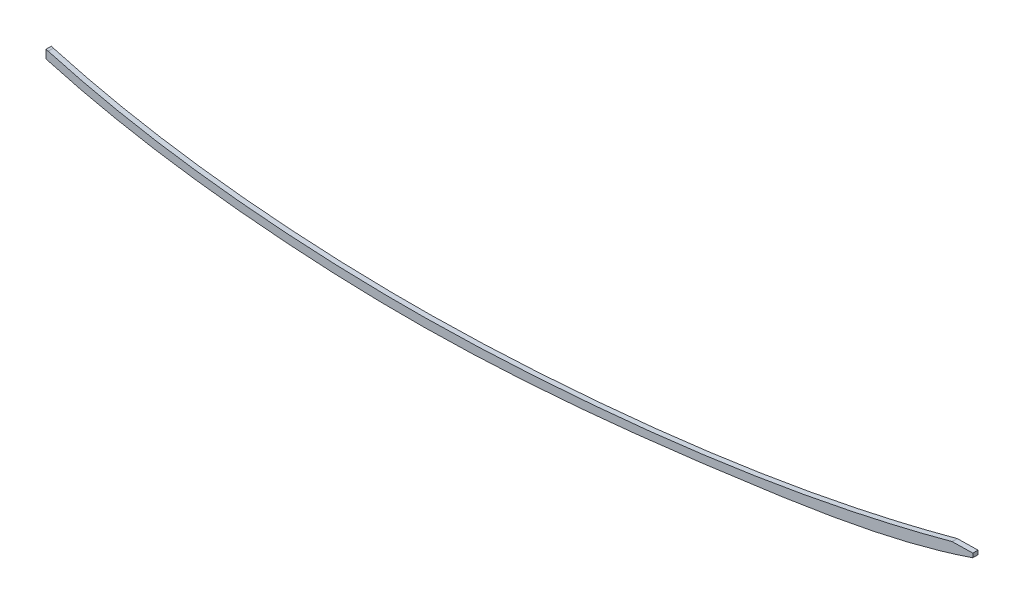
ISO-10303-21;
HEADER;
FILE_DESCRIPTION(('STEP AP214'),'2;1');
FILE_NAME('part.step','',(''),(''),'','','');
FILE_SCHEMA(('AUTOMOTIVE_DESIGN { 1 0 10303 214 1 1 1 1 }'));
ENDSEC;
DATA;
#1=APPLICATION_CONTEXT('core data for automotive mechanical design processes');
#2=APPLICATION_PROTOCOL_DEFINITION('international standard','automotive_design',2000,#1);
#3=PRODUCT_CONTEXT('',#1,'mechanical');
#4=PRODUCT('Part','Part','',(#3));
#5=PRODUCT_RELATED_PRODUCT_CATEGORY('part','',(#4));
#6=PRODUCT_DEFINITION_FORMATION('','',#4);
#7=PRODUCT_DEFINITION_CONTEXT('part definition',#1,'design');
#8=PRODUCT_DEFINITION('design','',#6,#7);
#9=PRODUCT_DEFINITION_SHAPE('','',#8);
#10=(LENGTH_UNIT() NAMED_UNIT(*) SI_UNIT(.MILLI.,.METRE.));
#11=(NAMED_UNIT(*) PLANE_ANGLE_UNIT() SI_UNIT($,.RADIAN.));
#12=(NAMED_UNIT(*) SI_UNIT($,.STERADIAN.) SOLID_ANGLE_UNIT());
#13=UNCERTAINTY_MEASURE_WITH_UNIT(LENGTH_MEASURE(1.E-05),#10,'distance_accuracy_value','');
#14=(GEOMETRIC_REPRESENTATION_CONTEXT(3) GLOBAL_UNCERTAINTY_ASSIGNED_CONTEXT((#13)) GLOBAL_UNIT_ASSIGNED_CONTEXT((#10,
#11,#12)) REPRESENTATION_CONTEXT('',''));
#15=CARTESIAN_POINT('',(0.,0.,0.));
#16=DIRECTION('',(0.,0.,1.));
#17=DIRECTION('',(1.,0.,0.));
#18=AXIS2_PLACEMENT_3D('',#15,#16,#17);
#19=CARTESIAN_POINT('',(-228.638126642223,-18.9655205888021,3.2));
#20=DIRECTION('',(-0.272374651087617,-0.962191274874647,0.));
#21=DIRECTION('',(0.962191274874647,-0.272374651087618,0.));
#22=AXIS2_PLACEMENT_3D('',#19,#20,#21);
#23=PLANE('',#22);
#24=DIRECTION('',(-0.962191274874647,0.272374651087618,0.));
#25=VECTOR('',#24,1.);
#26=CARTESIAN_POINT('',(-228.638126642223,-18.9655205888021,0.));
#27=LINE('',#26,#25);
#28=CARTESIAN_POINT('',(-228.638126642223,-18.9655205888021,0.));
#29=VERTEX_POINT('',#28);
#30=CARTESIAN_POINT('',(-229.999999898,-18.5800049823381,0.));
#31=VERTEX_POINT('',#30);
#32=EDGE_CURVE('E126',#29,#31,#27,.T.);
#33=ORIENTED_EDGE('',*,*,#32,.T.);
#34=DIRECTION('',(0.,0.,-1.));
#35=VECTOR('',#34,1.);
#36=CARTESIAN_POINT('',(-229.999999898,-18.5800049823381,3.2));
#37=LINE('',#36,#35);
#38=CARTESIAN_POINT('',(-229.999999898,-18.5800049823381,3.2));
#39=VERTEX_POINT('',#38);
#40=EDGE_CURVE('E11',#39,#31,#37,.T.);
#41=ORIENTED_EDGE('',*,*,#40,.F.);
#42=DIRECTION('',(-0.962191274874647,0.272374651087618,0.));
#43=VECTOR('',#42,1.);
#44=CARTESIAN_POINT('',(-228.638126642223,-18.9655205888021,3.2));
#45=LINE('',#44,#43);
#46=CARTESIAN_POINT('',(-228.638126642223,-18.9655205888021,3.2));
#47=VERTEX_POINT('',#46);
#48=EDGE_CURVE('E172',#47,#39,#45,.T.);
#49=ORIENTED_EDGE('',*,*,#48,.F.);
#50=DIRECTION('',(0.,0.,-1.));
#51=VECTOR('',#50,1.);
#52=CARTESIAN_POINT('',(-228.638126642223,-18.9655205888021,3.2));
#53=LINE('',#52,#51);
#54=EDGE_CURVE('E51',#47,#29,#53,.T.);
#55=ORIENTED_EDGE('',*,*,#54,.T.);
#56=EDGE_LOOP('',(#33,#41,#49,#55));
#57=FACE_BOUND('',#56,.T.);
#58=ADVANCED_FACE('F35',(#57),#23,.F.);
#59=CARTESIAN_POINT('',(-229.999999898,-18.5800049823381,3.2));
#60=DIRECTION('',(1.,0.,0.));
#61=DIRECTION('',(0.,0.,-1.));
#62=AXIS2_PLACEMENT_3D('',#59,#60,#61);
#63=PLANE('',#62);
#64=DIRECTION('',(0.,-1.,0.));
#65=VECTOR('',#64,1.);
#66=CARTESIAN_POINT('',(-229.999999898,-18.5800049823381,0.));
#67=LINE('',#66,#65);
#68=CARTESIAN_POINT('',(-229.999999898,-23.7764769632718,0.));
#69=VERTEX_POINT('',#68);
#70=EDGE_CURVE('E150',#31,#69,#67,.T.);
#71=ORIENTED_EDGE('',*,*,#70,.T.);
#72=DIRECTION('',(0.,0.,-1.));
#73=VECTOR('',#72,1.);
#74=CARTESIAN_POINT('',(-229.999999898,-23.7764769632718,3.2));
#75=LINE('',#74,#73);
#76=CARTESIAN_POINT('',(-229.999999898,-23.7764769632718,3.2));
#77=VERTEX_POINT('',#76);
#78=EDGE_CURVE('E43',#77,#69,#75,.T.);
#79=ORIENTED_EDGE('',*,*,#78,.F.);
#80=DIRECTION('',(0.,-1.,0.));
#81=VECTOR('',#80,1.);
#82=CARTESIAN_POINT('',(-229.999999898,-18.5800049823381,3.2));
#83=LINE('',#82,#81);
#84=EDGE_CURVE('E84',#39,#77,#83,.T.);
#85=ORIENTED_EDGE('',*,*,#84,.F.);
#86=ORIENTED_EDGE('',*,*,#40,.T.);
#87=EDGE_LOOP('',(#71,#79,#85,#86));
#88=FACE_BOUND('',#87,.T.);
#89=ADVANCED_FACE('F144',(#88),#63,.F.);
#90=CARTESIAN_POINT('',(-229.999999898,-23.7764769632718,3.2));
#91=CARTESIAN_POINT('',(-187.624946823335,-35.8107658786002,3.2));
#92=CARTESIAN_POINT('',(-110.757346564166,-47.3077333670935,3.2));
#93=CARTESIAN_POINT('',(0.00738065314822097,-52.0922228892119,3.2));
#94=CARTESIAN_POINT('',(100.34473306421,-46.3618079517477,3.2));
#95=CARTESIAN_POINT('',(200.209241180712,-34.2196693926498,3.2));
#96=CARTESIAN_POINT('',(281.165485841463,-22.0173816919297,3.2));
#97=CARTESIAN_POINT('',(326.582041191892,-8.95342530132101,3.2));
#98=CARTESIAN_POINT('',(339.743877835758,-4.47843019308316,3.2));
#99=B_SPLINE_CURVE_WITH_KNOTS('',3,(#90,#91,#92,#93,#94,#95,#96,#97,#98),.UNSPECIFIED.,.F.,.F.,
(4,1,1,1,1,1,4),(0.,0.225071004183071,0.39564019727107,0.566277038425493,0.737858902627529,
0.910958545331661,0.981893872620999),.UNSPECIFIED.);
#100=DIRECTION('',(0.,0.,-1.));
#101=VECTOR('',#100,1.);
#102=SURFACE_OF_LINEAR_EXTRUSION('',#99,#101);
#103=CARTESIAN_POINT('',(-229.999999898,-23.7764769632718,0.));
#104=CARTESIAN_POINT('',(-187.624946823335,-35.8107658786002,0.));
#105=CARTESIAN_POINT('',(-110.757346564166,-47.3077333670935,0.));
#106=CARTESIAN_POINT('',(0.00738065314822097,-52.0922228892119,0.));
#107=CARTESIAN_POINT('',(100.34473306421,-46.3618079517477,0.));
#108=CARTESIAN_POINT('',(200.209241180712,-34.2196693926498,0.));
#109=CARTESIAN_POINT('',(281.165485841463,-22.0173816919297,0.));
#110=CARTESIAN_POINT('',(326.582041191892,-8.95342530132101,0.));
#111=CARTESIAN_POINT('',(339.743877835758,-4.47843019308316,0.));
#112=B_SPLINE_CURVE_WITH_KNOTS('',3,(#103,#104,#105,#106,#107,#108,#109,#110,#111),
.UNSPECIFIED.,.F.,.F.,(4,1,1,1,1,1,4),(0.,0.225071004183071,0.39564019727107,0.566277038425493,
0.737858902627529,0.910958545331661,0.981893872620999),.UNSPECIFIED.);
#113=CARTESIAN_POINT('',(339.743877835758,-4.47843019308315,0.));
#114=VERTEX_POINT('',#113);
#115=EDGE_CURVE('E155',#69,#114,#112,.T.);
#116=ORIENTED_EDGE('',*,*,#115,.T.);
#117=DIRECTION('',(0.,0.,-1.));
#118=VECTOR('',#117,1.);
#119=CARTESIAN_POINT('',(339.743877835758,-4.47843019308315,3.2));
#120=LINE('',#119,#118);
#121=CARTESIAN_POINT('',(339.743877835758,-4.47843019308315,3.2));
#122=VERTEX_POINT('',#121);
#123=EDGE_CURVE('E103',#122,#114,#120,.T.);
#124=ORIENTED_EDGE('',*,*,#123,.F.);
#125=EDGE_CURVE('E113',#77,#122,#99,.T.);
#126=ORIENTED_EDGE('',*,*,#125,.F.);
#127=ORIENTED_EDGE('',*,*,#78,.T.);
#128=EDGE_LOOP('',(#116,#124,#126,#127));
#129=FACE_BOUND('',#128,.T.);
#130=ADVANCED_FACE('F142',(#129),#102,.F.);
#131=CARTESIAN_POINT('',(339.743877835758,-1.97092204003724,3.2));
#132=DIRECTION('',(1.,0.,0.));
#133=DIRECTION('',(0.,0.,-1.));
#134=AXIS2_PLACEMENT_3D('',#131,#132,#133);
#135=PLANE('',#134);
#136=DIRECTION('',(0.,-1.,0.));
#137=VECTOR('',#136,1.);
#138=CARTESIAN_POINT('',(339.743877835758,-1.97092204003724,0.));
#139=LINE('',#138,#137);
#140=CARTESIAN_POINT('',(339.743877835758,-1.97092204003724,0.));
#141=VERTEX_POINT('',#140);
#142=EDGE_CURVE('E100',#141,#114,#139,.T.);
#143=ORIENTED_EDGE('',*,*,#142,.F.);
#144=DIRECTION('',(0.,0.,-1.));
#145=VECTOR('',#144,1.);
#146=CARTESIAN_POINT('',(339.743877835758,-1.97092204003724,3.2));
#147=LINE('',#146,#145);
#148=CARTESIAN_POINT('',(339.743877835758,-1.97092204003724,3.2));
#149=VERTEX_POINT('',#148);
#150=EDGE_CURVE('E94',#149,#141,#147,.T.);
#151=ORIENTED_EDGE('',*,*,#150,.F.);
#152=DIRECTION('',(0.,-1.,0.));
#153=VECTOR('',#152,1.);
#154=CARTESIAN_POINT('',(339.743877835758,-1.97092204003724,3.2));
#155=LINE('',#154,#153);
#156=EDGE_CURVE('E98',#149,#122,#155,.T.);
#157=ORIENTED_EDGE('',*,*,#156,.T.);
#158=ORIENTED_EDGE('',*,*,#123,.T.);
#159=EDGE_LOOP('',(#143,#151,#157,#158));
#160=FACE_BOUND('',#159,.T.);
#161=ADVANCED_FACE('F96',(#160),#135,.T.);
#162=CARTESIAN_POINT('',(339.743877835758,-1.97092204003724,3.2));
#163=DIRECTION('',(0.0185915765527172,-0.999827161704104,0.));
#164=DIRECTION('',(0.999827161704104,0.0185915765527172,0.));
#165=AXIS2_PLACEMENT_3D('',#162,#163,#164);
#166=PLANE('',#165);
#167=DIRECTION('',(-0.999827161704104,-0.0185915765527172,0.));
#168=VECTOR('',#167,1.);
#169=CARTESIAN_POINT('',(339.743877835758,-1.97092204003724,0.));
#170=LINE('',#169,#168);
#171=CARTESIAN_POINT('',(327.028680723974,-2.20735846579277,0.));
#172=VERTEX_POINT('',#171);
#173=EDGE_CURVE('E158',#141,#172,#170,.T.);
#174=ORIENTED_EDGE('',*,*,#173,.T.);
#175=DIRECTION('',(0.,0.,-1.));
#176=VECTOR('',#175,1.);
#177=CARTESIAN_POINT('',(327.028680723974,-2.20735846579277,3.2));
#178=LINE('',#177,#176);
#179=CARTESIAN_POINT('',(327.028680723974,-2.20735846579277,3.2));
#180=VERTEX_POINT('',#179);
#181=EDGE_CURVE('E72',#180,#172,#178,.T.);
#182=ORIENTED_EDGE('',*,*,#181,.F.);
#183=DIRECTION('',(-0.999827161704104,-0.0185915765527172,0.));
#184=VECTOR('',#183,1.);
#185=CARTESIAN_POINT('',(339.743877835758,-1.97092204003724,3.2));
#186=LINE('',#185,#184);
#187=EDGE_CURVE('E105',#149,#180,#186,.T.);
#188=ORIENTED_EDGE('',*,*,#187,.F.);
#189=ORIENTED_EDGE('',*,*,#150,.T.);
#190=EDGE_LOOP('',(#174,#182,#188,#189));
#191=FACE_BOUND('',#190,.T.);
#192=ADVANCED_FACE('F106',(#191),#166,.F.);
#193=CARTESIAN_POINT('',(-228.638126642223,-18.9655205888021,3.2));
#194=CARTESIAN_POINT('',(-205.328000422366,-25.5640916439897,3.2));
#195=CARTESIAN_POINT('',(-169.713782969925,-33.0482863059943,3.2));
#196=CARTESIAN_POINT('',(-121.506682722074,-39.3796880088339,3.2));
#197=CARTESIAN_POINT('',(-73.0123108795107,-43.7075849784723,3.2));
#198=CARTESIAN_POINT('',(-12.2033366666373,-45.8684044670581,3.2));
#199=CARTESIAN_POINT('',(48.6363528488874,-44.0362314724547,3.2));
#200=CARTESIAN_POINT('',(97.2556682771787,-40.6615077495447,3.2));
#201=CARTESIAN_POINT('',(145.796442696134,-36.2030353016287,3.2));
#202=CARTESIAN_POINT('',(206.192712117891,-28.4413799366134,3.2));
#203=CARTESIAN_POINT('',(266.013860498578,-17.2755772931033,3.2));
#204=CARTESIAN_POINT('',(306.123232335345,-7.74319274179307,3.2));
#205=CARTESIAN_POINT('',(322.47220691642,-3.44007874500128,3.2));
#206=CARTESIAN_POINT('',(327.028680723974,-2.20735846579277,3.2));
#207=B_SPLINE_CURVE_WITH_KNOTS('',3,(#193,#194,#195,#196,#197,#198,#199,#200,#201,#202,#203,
#204,#205,#206),.UNSPECIFIED.,.F.,.F.,(4,1,1,1,1,1,1,1,1,1,1,4),(0.,0.125,0.1875,0.25,0.375,0.5,
0.5625,0.625,0.75,0.875,0.9375,0.961706412956366),.UNSPECIFIED.);
#208=DIRECTION('',(0.,0.,-1.));
#209=VECTOR('',#208,1.);
#210=SURFACE_OF_LINEAR_EXTRUSION('',#207,#209);
#211=CARTESIAN_POINT('',(-228.638126642223,-18.9655205888021,0.));
#212=CARTESIAN_POINT('',(-205.328000422366,-25.5640916439897,0.));
#213=CARTESIAN_POINT('',(-169.713782969925,-33.0482863059943,0.));
#214=CARTESIAN_POINT('',(-121.506682722074,-39.3796880088339,0.));
#215=CARTESIAN_POINT('',(-73.0123108795107,-43.7075849784723,0.));
#216=CARTESIAN_POINT('',(-12.2033366666373,-45.8684044670581,0.));
#217=CARTESIAN_POINT('',(48.6363528488874,-44.0362314724547,0.));
#218=CARTESIAN_POINT('',(97.2556682771787,-40.6615077495447,0.));
#219=CARTESIAN_POINT('',(145.796442696134,-36.2030353016287,0.));
#220=CARTESIAN_POINT('',(206.192712117891,-28.4413799366134,0.));
#221=CARTESIAN_POINT('',(266.013860498578,-17.2755772931033,0.));
#222=CARTESIAN_POINT('',(306.123232335345,-7.74319274179307,0.));
#223=CARTESIAN_POINT('',(322.47220691642,-3.44007874500128,0.));
#224=CARTESIAN_POINT('',(327.028680723974,-2.20735846579277,0.));
#225=B_SPLINE_CURVE_WITH_KNOTS('',3,(#211,#212,#213,#214,#215,#216,#217,#218,#219,#220,#221,
#222,#223,#224),.UNSPECIFIED.,.F.,.F.,(4,1,1,1,1,1,1,1,1,1,1,4),(0.,0.125,0.1875,0.25,0.375,0.5,
0.5625,0.625,0.75,0.875,0.9375,0.961706412956366),.UNSPECIFIED.);
#226=EDGE_CURVE('E167',#29,#172,#225,.T.);
#227=ORIENTED_EDGE('',*,*,#226,.F.);
#228=ORIENTED_EDGE('',*,*,#54,.F.);
#229=EDGE_CURVE('E109',#47,#180,#207,.T.);
#230=ORIENTED_EDGE('',*,*,#229,.T.);
#231=ORIENTED_EDGE('',*,*,#181,.T.);
#232=EDGE_LOOP('',(#227,#228,#230,#231));
#233=FACE_BOUND('',#232,.T.);
#234=ADVANCED_FACE('F132',(#233),#210,.T.);
#235=CARTESIAN_POINT('',(55.9128897611061,-48.5700916446603,3.2));
#236=DIRECTION('',(0.,0.,-1.));
#237=DIRECTION('',(-1.,0.,0.));
#238=AXIS2_PLACEMENT_3D('',#235,#236,#237);
#239=PLANE('',#238);
#240=ORIENTED_EDGE('',*,*,#48,.T.);
#241=ORIENTED_EDGE('',*,*,#84,.T.);
#242=ORIENTED_EDGE('',*,*,#125,.T.);
#243=ORIENTED_EDGE('',*,*,#156,.F.);
#244=ORIENTED_EDGE('',*,*,#187,.T.);
#245=ORIENTED_EDGE('',*,*,#229,.F.);
#246=EDGE_LOOP('',(#240,#241,#242,#243,#244,#245));
#247=FACE_BOUND('',#246,.T.);
#248=ADVANCED_FACE('F111',(#247),#239,.F.);
#249=CARTESIAN_POINT('',(55.9128897611061,-48.5700916446603,0.));
#250=DIRECTION('',(0.,0.,-1.));
#251=DIRECTION('',(-1.,0.,0.));
#252=AXIS2_PLACEMENT_3D('',#249,#250,#251);
#253=PLANE('',#252);
#254=ORIENTED_EDGE('',*,*,#32,.F.);
#255=ORIENTED_EDGE('',*,*,#226,.T.);
#256=ORIENTED_EDGE('',*,*,#173,.F.);
#257=ORIENTED_EDGE('',*,*,#142,.T.);
#258=ORIENTED_EDGE('',*,*,#115,.F.);
#259=ORIENTED_EDGE('',*,*,#70,.F.);
#260=EDGE_LOOP('',(#254,#255,#256,#257,#258,#259));
#261=FACE_BOUND('',#260,.T.);
#262=ADVANCED_FACE('F136',(#261),#253,.T.);
#263=CLOSED_SHELL('',(#58,#89,#130,#161,#192,#234,#248,#262));
#264=MANIFOLD_SOLID_BREP('B2',#263);
#265=ADVANCED_BREP_SHAPE_REPRESENTATION('',(#18,#264),#14);
#266=SHAPE_DEFINITION_REPRESENTATION(#9,#265);
ENDSEC;
END-ISO-10303-21;
